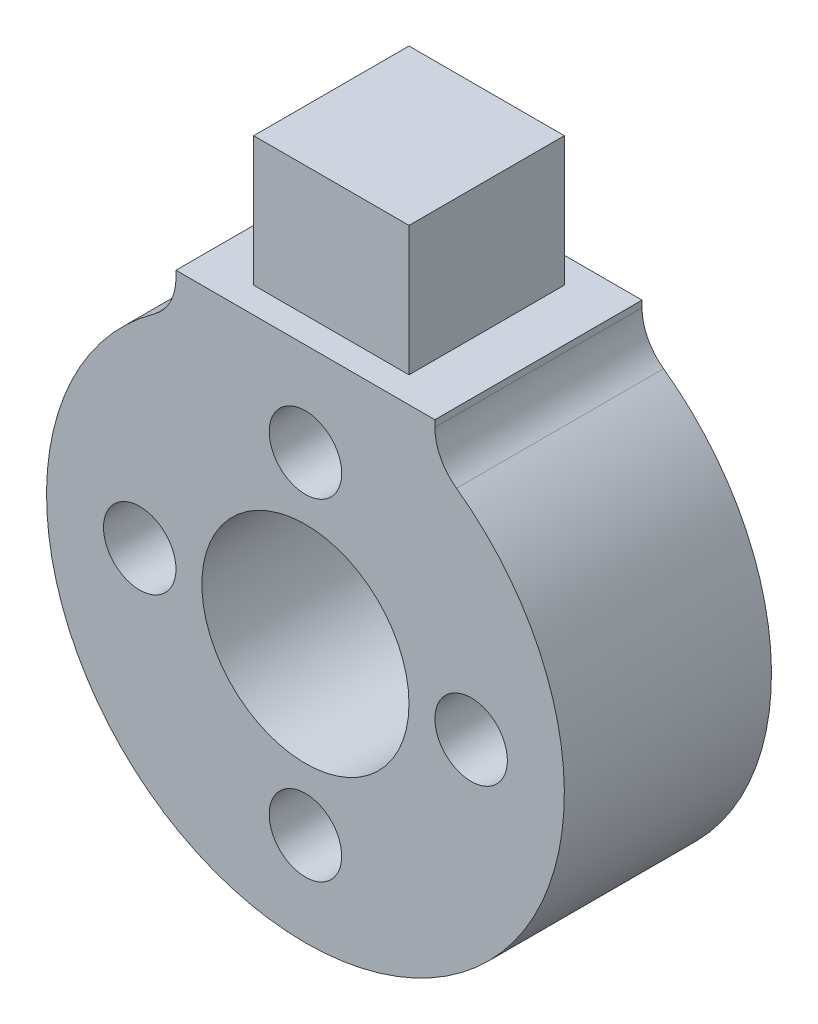
ISO-10303-21;
HEADER;
FILE_DESCRIPTION(('STEP AP214'),'2;1');
FILE_NAME('part.step','',(''),(''),'','','');
FILE_SCHEMA(('AUTOMOTIVE_DESIGN { 1 0 10303 214 1 1 1 1 }'));
ENDSEC;
DATA;
#1=APPLICATION_CONTEXT('core data for automotive mechanical design processes');
#2=APPLICATION_PROTOCOL_DEFINITION('international standard','automotive_design',2000,#1);
#3=PRODUCT_CONTEXT('',#1,'mechanical');
#4=PRODUCT('Part','Part','',(#3));
#5=PRODUCT_RELATED_PRODUCT_CATEGORY('part','',(#4));
#6=PRODUCT_DEFINITION_FORMATION('','',#4);
#7=PRODUCT_DEFINITION_CONTEXT('part definition',#1,'design');
#8=PRODUCT_DEFINITION('design','',#6,#7);
#9=PRODUCT_DEFINITION_SHAPE('','',#8);
#10=(LENGTH_UNIT() NAMED_UNIT(*) SI_UNIT(.MILLI.,.METRE.));
#11=(NAMED_UNIT(*) PLANE_ANGLE_UNIT() SI_UNIT($,.RADIAN.));
#12=(NAMED_UNIT(*) SI_UNIT($,.STERADIAN.) SOLID_ANGLE_UNIT());
#13=UNCERTAINTY_MEASURE_WITH_UNIT(LENGTH_MEASURE(1.E-05),#10,'distance_accuracy_value','');
#14=(GEOMETRIC_REPRESENTATION_CONTEXT(3) GLOBAL_UNCERTAINTY_ASSIGNED_CONTEXT((#13)) GLOBAL_UNIT_ASSIGNED_CONTEXT((#10,
#11,#12)) REPRESENTATION_CONTEXT('',''));
#15=CARTESIAN_POINT('',(0.,0.,0.));
#16=DIRECTION('',(0.,0.,1.));
#17=DIRECTION('',(1.,0.,0.));
#18=AXIS2_PLACEMENT_3D('',#15,#16,#17);
#19=CARTESIAN_POINT('',(0.,0.,10.16));
#20=DIRECTION('',(0.,0.,1.));
#21=DIRECTION('',(1.,0.,0.));
#22=AXIS2_PLACEMENT_3D('',#19,#20,#21);
#23=PLANE('',#22);
#24=CARTESIAN_POINT('',(8.128,0.,10.16));
#25=DIRECTION('',(0.,0.,1.));
#26=DIRECTION('',(1.,0.,0.));
#27=AXIS2_PLACEMENT_3D('',#24,#25,#26);
#28=CIRCLE('',#27,1.778);
#29=CARTESIAN_POINT('',(9.906,0.,10.16));
#30=VERTEX_POINT('',#29);
#31=EDGE_CURVE('E235',#30,#30,#28,.T.);
#32=ORIENTED_EDGE('',*,*,#31,.F.);
#33=EDGE_LOOP('',(#32));
#34=FACE_BOUND('',#33,.T.);
#35=CARTESIAN_POINT('',(1.61409540099723E-12,-8.128,10.16));
#36=DIRECTION('',(0.,0.,1.));
#37=DIRECTION('',(1.,0.,0.));
#38=AXIS2_PLACEMENT_3D('',#35,#36,#37);
#39=CIRCLE('',#38,1.7780000000016);
#40=CARTESIAN_POINT('',(1.77800000000321,-8.128,10.16));
#41=VERTEX_POINT('',#40);
#42=EDGE_CURVE('E251',#41,#41,#39,.T.);
#43=ORIENTED_EDGE('',*,*,#42,.F.);
#44=EDGE_LOOP('',(#43));
#45=FACE_BOUND('',#44,.T.);
#46=DIRECTION('',(1.,0.,0.));
#47=VECTOR('',#46,1.);
#48=CARTESIAN_POINT('',(-6.35,12.7,10.16));
#49=LINE('',#48,#47);
#50=CARTESIAN_POINT('',(-6.35,12.7,10.16));
#51=VERTEX_POINT('',#50);
#52=CARTESIAN_POINT('',(6.35,12.7,10.16));
#53=VERTEX_POINT('',#52);
#54=EDGE_CURVE('E267',#51,#53,#49,.T.);
#55=ORIENTED_EDGE('',*,*,#54,.F.);
#56=DIRECTION('',(0.,-1.,0.));
#57=VECTOR('',#56,1.);
#58=CARTESIAN_POINT('',(-6.35,12.7,10.16));
#59=LINE('',#58,#57);
#60=CARTESIAN_POINT('',(-6.35,12.3784288179074,10.16));
#61=VERTEX_POINT('',#60);
#62=EDGE_CURVE('E280',#51,#61,#59,.T.);
#63=ORIENTED_EDGE('',*,*,#62,.T.);
#64=CARTESIAN_POINT('',(-8.89,12.3784288179074,10.16));
#65=DIRECTION('',(0.,0.,1.));
#66=DIRECTION('',(1.,0.,0.));
#67=AXIS2_PLACEMENT_3D('',#64,#65,#66);
#68=CIRCLE('',#67,2.54);
#69=CARTESIAN_POINT('',(-7.40833333333333,10.3153573482562,10.16));
#70=VERTEX_POINT('',#69);
#71=EDGE_CURVE('E12',#61,#70,#68,.F.);
#72=ORIENTED_EDGE('',*,*,#71,.T.);
#73=CARTESIAN_POINT('',(0.,0.,10.16));
#74=DIRECTION('',(0.,0.,1.));
#75=DIRECTION('',(1.,0.,0.));
#76=AXIS2_PLACEMENT_3D('',#73,#74,#75);
#77=CIRCLE('',#76,12.7);
#78=CARTESIAN_POINT('',(7.40833333333333,10.3153573482562,10.16));
#79=VERTEX_POINT('',#78);
#80=EDGE_CURVE('E276',#70,#79,#77,.T.);
#81=ORIENTED_EDGE('',*,*,#80,.T.);
#82=CARTESIAN_POINT('',(8.89,12.3784288179074,10.16));
#83=DIRECTION('',(0.,0.,1.));
#84=DIRECTION('',(1.,0.,0.));
#85=AXIS2_PLACEMENT_3D('',#82,#83,#84);
#86=CIRCLE('',#85,2.54);
#87=CARTESIAN_POINT('',(6.35,12.3784288179074,10.16));
#88=VERTEX_POINT('',#87);
#89=EDGE_CURVE('E321',#79,#88,#86,.F.);
#90=ORIENTED_EDGE('',*,*,#89,.T.);
#91=DIRECTION('',(0.,-1.,0.));
#92=VECTOR('',#91,1.);
#93=CARTESIAN_POINT('',(6.35,12.7,10.16));
#94=LINE('',#93,#92);
#95=EDGE_CURVE('E271',#53,#88,#94,.T.);
#96=ORIENTED_EDGE('',*,*,#95,.F.);
#97=EDGE_LOOP('',(#55,#63,#72,#81,#90,#96));
#98=FACE_BOUND('',#97,.T.);
#99=CARTESIAN_POINT('',(0.,0.,10.16));
#100=DIRECTION('',(0.,0.,1.));
#101=DIRECTION('',(1.,0.,0.));
#102=AXIS2_PLACEMENT_3D('',#99,#100,#101);
#103=CIRCLE('',#102,5.08);
#104=CARTESIAN_POINT('',(5.08,0.,10.16));
#105=VERTEX_POINT('',#104);
#106=EDGE_CURVE('E259',#105,#105,#103,.T.);
#107=ORIENTED_EDGE('',*,*,#106,.F.);
#108=EDGE_LOOP('',(#107));
#109=FACE_BOUND('',#108,.T.);
#110=CARTESIAN_POINT('',(-8.128,0.,10.16));
#111=DIRECTION('',(0.,0.,1.));
#112=DIRECTION('',(1.,0.,0.));
#113=AXIS2_PLACEMENT_3D('',#110,#111,#112);
#114=CIRCLE('',#113,1.778);
#115=CARTESIAN_POINT('',(-6.35,0.,10.16));
#116=VERTEX_POINT('',#115);
#117=EDGE_CURVE('E243',#116,#116,#114,.T.);
#118=ORIENTED_EDGE('',*,*,#117,.F.);
#119=EDGE_LOOP('',(#118));
#120=FACE_BOUND('',#119,.T.);
#121=CARTESIAN_POINT('',(0.,8.128,10.16));
#122=DIRECTION('',(0.,0.,1.));
#123=DIRECTION('',(1.,0.,0.));
#124=AXIS2_PLACEMENT_3D('',#121,#122,#123);
#125=CIRCLE('',#124,1.778);
#126=CARTESIAN_POINT('',(1.778,8.128,10.16));
#127=VERTEX_POINT('',#126);
#128=EDGE_CURVE('E225',#127,#127,#125,.T.);
#129=ORIENTED_EDGE('',*,*,#128,.F.);
#130=EDGE_LOOP('',(#129));
#131=FACE_BOUND('',#130,.T.);
#132=ADVANCED_FACE('F120',(#34,#45,#98,#109,#120,#131),#23,.T.);
#133=CARTESIAN_POINT('',(0.,0.,0.));
#134=DIRECTION('',(0.,0.,1.));
#135=DIRECTION('',(1.,0.,0.));
#136=AXIS2_PLACEMENT_3D('',#133,#134,#135);
#137=PLANE('',#136);
#138=DIRECTION('',(1.,0.,0.));
#139=VECTOR('',#138,1.);
#140=CARTESIAN_POINT('',(-6.35,12.7,0.));
#141=LINE('',#140,#139);
#142=CARTESIAN_POINT('',(-6.35,12.7,0.));
#143=VERTEX_POINT('',#142);
#144=CARTESIAN_POINT('',(6.35,12.7,0.));
#145=VERTEX_POINT('',#144);
#146=EDGE_CURVE('E263',#143,#145,#141,.T.);
#147=ORIENTED_EDGE('',*,*,#146,.T.);
#148=DIRECTION('',(0.,-1.,0.));
#149=VECTOR('',#148,1.);
#150=CARTESIAN_POINT('',(6.35,12.7,0.));
#151=LINE('',#150,#149);
#152=CARTESIAN_POINT('',(6.35,12.3784288179074,0.));
#153=VERTEX_POINT('',#152);
#154=EDGE_CURVE('E288',#145,#153,#151,.T.);
#155=ORIENTED_EDGE('',*,*,#154,.T.);
#156=CARTESIAN_POINT('',(8.89,12.3784288179074,0.));
#157=DIRECTION('',(0.,0.,1.));
#158=DIRECTION('',(1.,0.,0.));
#159=AXIS2_PLACEMENT_3D('',#156,#157,#158);
#160=CIRCLE('',#159,2.54);
#161=CARTESIAN_POINT('',(7.40833333333333,10.3153573482562,0.));
#162=VERTEX_POINT('',#161);
#163=EDGE_CURVE('E318',#153,#162,#160,.T.);
#164=ORIENTED_EDGE('',*,*,#163,.T.);
#165=CARTESIAN_POINT('',(0.,0.,0.));
#166=DIRECTION('',(0.,0.,1.));
#167=DIRECTION('',(1.,0.,0.));
#168=AXIS2_PLACEMENT_3D('',#165,#166,#167);
#169=CIRCLE('',#168,12.7);
#170=CARTESIAN_POINT('',(-7.40833333333333,10.3153573482562,0.));
#171=VERTEX_POINT('',#170);
#172=EDGE_CURVE('E292',#171,#162,#169,.T.);
#173=ORIENTED_EDGE('',*,*,#172,.F.);
#174=CARTESIAN_POINT('',(-8.89,12.3784288179074,0.));
#175=DIRECTION('',(0.,0.,1.));
#176=DIRECTION('',(1.,0.,0.));
#177=AXIS2_PLACEMENT_3D('',#174,#175,#176);
#178=CIRCLE('',#177,2.54);
#179=CARTESIAN_POINT('',(-6.35,12.3784288179074,0.));
#180=VERTEX_POINT('',#179);
#181=EDGE_CURVE('E129',#171,#180,#178,.T.);
#182=ORIENTED_EDGE('',*,*,#181,.T.);
#183=DIRECTION('',(0.,-1.,0.));
#184=VECTOR('',#183,1.);
#185=CARTESIAN_POINT('',(-6.35,12.7,0.));
#186=LINE('',#185,#184);
#187=EDGE_CURVE('E272',#143,#180,#186,.T.);
#188=ORIENTED_EDGE('',*,*,#187,.F.);
#189=EDGE_LOOP('',(#147,#155,#164,#173,#182,#188));
#190=FACE_BOUND('',#189,.T.);
#191=CARTESIAN_POINT('',(0.,0.,0.));
#192=DIRECTION('',(0.,0.,1.));
#193=DIRECTION('',(1.,0.,0.));
#194=AXIS2_PLACEMENT_3D('',#191,#192,#193);
#195=CIRCLE('',#194,5.08);
#196=CARTESIAN_POINT('',(5.08,0.,0.));
#197=VERTEX_POINT('',#196);
#198=EDGE_CURVE('E255',#197,#197,#195,.T.);
#199=ORIENTED_EDGE('',*,*,#198,.T.);
#200=EDGE_LOOP('',(#199));
#201=FACE_BOUND('',#200,.T.);
#202=CARTESIAN_POINT('',(1.61409540099723E-12,-8.128,0.));
#203=DIRECTION('',(0.,0.,1.));
#204=DIRECTION('',(1.,0.,0.));
#205=AXIS2_PLACEMENT_3D('',#202,#203,#204);
#206=CIRCLE('',#205,1.7780000000016);
#207=CARTESIAN_POINT('',(1.77800000000321,-8.128,0.));
#208=VERTEX_POINT('',#207);
#209=EDGE_CURVE('E247',#208,#208,#206,.T.);
#210=ORIENTED_EDGE('',*,*,#209,.T.);
#211=EDGE_LOOP('',(#210));
#212=FACE_BOUND('',#211,.T.);
#213=CARTESIAN_POINT('',(-8.128,0.,0.));
#214=DIRECTION('',(0.,0.,1.));
#215=DIRECTION('',(1.,0.,0.));
#216=AXIS2_PLACEMENT_3D('',#213,#214,#215);
#217=CIRCLE('',#216,1.778);
#218=CARTESIAN_POINT('',(-6.35,0.,0.));
#219=VERTEX_POINT('',#218);
#220=EDGE_CURVE('E239',#219,#219,#217,.T.);
#221=ORIENTED_EDGE('',*,*,#220,.T.);
#222=EDGE_LOOP('',(#221));
#223=FACE_BOUND('',#222,.T.);
#224=CARTESIAN_POINT('',(8.128,0.,0.));
#225=DIRECTION('',(0.,0.,1.));
#226=DIRECTION('',(1.,0.,0.));
#227=AXIS2_PLACEMENT_3D('',#224,#225,#226);
#228=CIRCLE('',#227,1.778);
#229=CARTESIAN_POINT('',(9.906,0.,0.));
#230=VERTEX_POINT('',#229);
#231=EDGE_CURVE('E233',#230,#230,#228,.T.);
#232=ORIENTED_EDGE('',*,*,#231,.T.);
#233=EDGE_LOOP('',(#232));
#234=FACE_BOUND('',#233,.T.);
#235=CARTESIAN_POINT('',(0.,8.128,0.));
#236=DIRECTION('',(0.,0.,1.));
#237=DIRECTION('',(1.,0.,0.));
#238=AXIS2_PLACEMENT_3D('',#235,#236,#237);
#239=CIRCLE('',#238,1.778);
#240=CARTESIAN_POINT('',(1.778,8.128,0.));
#241=VERTEX_POINT('',#240);
#242=EDGE_CURVE('E220',#241,#241,#239,.T.);
#243=ORIENTED_EDGE('',*,*,#242,.T.);
#244=EDGE_LOOP('',(#243));
#245=FACE_BOUND('',#244,.T.);
#246=ADVANCED_FACE('F327',(#190,#201,#212,#223,#234,#245),#137,.F.);
#247=CARTESIAN_POINT('',(-6.35,12.7,10.16));
#248=DIRECTION('',(0.,1.,0.));
#249=DIRECTION('',(0.,0.,1.));
#250=AXIS2_PLACEMENT_3D('',#247,#248,#249);
#251=PLANE('',#250);
#252=DIRECTION('',(0.,0.,-1.));
#253=VECTOR('',#252,1.);
#254=CARTESIAN_POINT('',(3.81,12.7,8.89));
#255=LINE('',#254,#253);
#256=CARTESIAN_POINT('',(3.81,12.7,8.89));
#257=VERTEX_POINT('',#256);
#258=CARTESIAN_POINT('',(3.81,12.7,1.27));
#259=VERTEX_POINT('',#258);
#260=EDGE_CURVE('E136',#257,#259,#255,.T.);
#261=ORIENTED_EDGE('',*,*,#260,.F.);
#262=DIRECTION('',(1.,0.,0.));
#263=VECTOR('',#262,1.);
#264=CARTESIAN_POINT('',(-3.81,12.7,8.89));
#265=LINE('',#264,#263);
#266=CARTESIAN_POINT('',(-3.81,12.7,8.89));
#267=VERTEX_POINT('',#266);
#268=EDGE_CURVE('E140',#267,#257,#265,.T.);
#269=ORIENTED_EDGE('',*,*,#268,.F.);
#270=DIRECTION('',(0.,0.,1.));
#271=VECTOR('',#270,1.);
#272=CARTESIAN_POINT('',(-3.81,12.7,8.89));
#273=LINE('',#272,#271);
#274=CARTESIAN_POINT('',(-3.81,12.7,1.27));
#275=VERTEX_POINT('',#274);
#276=EDGE_CURVE('E570',#275,#267,#273,.T.);
#277=ORIENTED_EDGE('',*,*,#276,.F.);
#278=DIRECTION('',(-1.,0.,0.));
#279=VECTOR('',#278,1.);
#280=CARTESIAN_POINT('',(-3.81,12.7,1.27));
#281=LINE('',#280,#279);
#282=EDGE_CURVE('E580',#259,#275,#281,.T.);
#283=ORIENTED_EDGE('',*,*,#282,.F.);
#284=EDGE_LOOP('',(#261,#269,#277,#283));
#285=FACE_BOUND('',#284,.T.);
#286=ORIENTED_EDGE('',*,*,#146,.F.);
#287=DIRECTION('',(0.,0.,-1.));
#288=VECTOR('',#287,1.);
#289=CARTESIAN_POINT('',(-6.35,12.7,10.16));
#290=LINE('',#289,#288);
#291=EDGE_CURVE('E299',#51,#143,#290,.T.);
#292=ORIENTED_EDGE('',*,*,#291,.F.);
#293=ORIENTED_EDGE('',*,*,#54,.T.);
#294=DIRECTION('',(0.,0.,-1.));
#295=VECTOR('',#294,1.);
#296=CARTESIAN_POINT('',(6.35,12.7,10.16));
#297=LINE('',#296,#295);
#298=EDGE_CURVE('E284',#53,#145,#297,.T.);
#299=ORIENTED_EDGE('',*,*,#298,.T.);
#300=EDGE_LOOP('',(#286,#292,#293,#299));
#301=FACE_BOUND('',#300,.T.);
#302=ADVANCED_FACE('F353',(#285,#301),#251,.T.);
#303=CARTESIAN_POINT('',(-6.35,12.7,10.16));
#304=DIRECTION('',(1.,0.,0.));
#305=DIRECTION('',(0.,0.,-1.));
#306=AXIS2_PLACEMENT_3D('',#303,#304,#305);
#307=PLANE('',#306);
#308=ORIENTED_EDGE('',*,*,#187,.T.);
#309=DIRECTION('',(0.,0.,1.));
#310=VECTOR('',#309,1.);
#311=CARTESIAN_POINT('',(-6.35,12.3784288179074,10.16));
#312=LINE('',#311,#310);
#313=EDGE_CURVE('E315',#180,#61,#312,.T.);
#314=ORIENTED_EDGE('',*,*,#313,.T.);
#315=ORIENTED_EDGE('',*,*,#62,.F.);
#316=ORIENTED_EDGE('',*,*,#291,.T.);
#317=EDGE_LOOP('',(#308,#314,#315,#316));
#318=FACE_BOUND('',#317,.T.);
#319=ADVANCED_FACE('F334',(#318),#307,.F.);
#320=CARTESIAN_POINT('',(0.,0.,10.16));
#321=DIRECTION('',(0.,0.,-1.));
#322=DIRECTION('',(-1.,0.,0.));
#323=AXIS2_PLACEMENT_3D('',#320,#321,#322);
#324=CYLINDRICAL_SURFACE('',#323,12.7);
#325=ORIENTED_EDGE('',*,*,#172,.T.);
#326=DIRECTION('',(0.,0.,-1.));
#327=VECTOR('',#326,1.);
#328=CARTESIAN_POINT('',(7.40833333333333,10.3153573482562,10.16));
#329=LINE('',#328,#327);
#330=EDGE_CURVE('E312',#162,#79,#329,.F.);
#331=ORIENTED_EDGE('',*,*,#330,.T.);
#332=ORIENTED_EDGE('',*,*,#80,.F.);
#333=DIRECTION('',(0.,0.,-1.));
#334=VECTOR('',#333,1.);
#335=CARTESIAN_POINT('',(-7.40833333333333,10.3153573482562,10.16));
#336=LINE('',#335,#334);
#337=EDGE_CURVE('E308',#70,#171,#336,.T.);
#338=ORIENTED_EDGE('',*,*,#337,.T.);
#339=EDGE_LOOP('',(#325,#331,#332,#338));
#340=FACE_BOUND('',#339,.T.);
#341=ADVANCED_FACE('F343',(#340),#324,.T.);
#342=CARTESIAN_POINT('',(6.35,12.7,10.16));
#343=DIRECTION('',(1.,0.,0.));
#344=DIRECTION('',(0.,0.,-1.));
#345=AXIS2_PLACEMENT_3D('',#342,#343,#344);
#346=PLANE('',#345);
#347=ORIENTED_EDGE('',*,*,#95,.T.);
#348=DIRECTION('',(0.,0.,-1.));
#349=VECTOR('',#348,1.);
#350=CARTESIAN_POINT('',(6.35,12.3784288179074,10.16));
#351=LINE('',#350,#349);
#352=EDGE_CURVE('E302',#88,#153,#351,.T.);
#353=ORIENTED_EDGE('',*,*,#352,.T.);
#354=ORIENTED_EDGE('',*,*,#154,.F.);
#355=ORIENTED_EDGE('',*,*,#298,.F.);
#356=EDGE_LOOP('',(#347,#353,#354,#355));
#357=FACE_BOUND('',#356,.T.);
#358=ADVANCED_FACE('F350',(#357),#346,.T.);
#359=CARTESIAN_POINT('',(0.,0.,10.16));
#360=DIRECTION('',(0.,0.,-1.));
#361=DIRECTION('',(-1.,0.,0.));
#362=AXIS2_PLACEMENT_3D('',#359,#360,#361);
#363=CYLINDRICAL_SURFACE('',#362,5.08);
#364=ORIENTED_EDGE('',*,*,#106,.T.);
#365=EDGE_LOOP('',(#364));
#366=FACE_BOUND('',#365,.T.);
#367=ORIENTED_EDGE('',*,*,#198,.F.);
#368=EDGE_LOOP('',(#367));
#369=FACE_BOUND('',#368,.T.);
#370=ADVANCED_FACE('F373',(#366,#369),#363,.F.);
#371=CARTESIAN_POINT('',(1.61409540099723E-12,-8.128,10.16));
#372=DIRECTION('',(0.,0.,-1.));
#373=DIRECTION('',(-1.,0.,0.));
#374=AXIS2_PLACEMENT_3D('',#371,#372,#373);
#375=CYLINDRICAL_SURFACE('',#374,1.7780000000016);
#376=ORIENTED_EDGE('',*,*,#42,.T.);
#377=EDGE_LOOP('',(#376));
#378=FACE_BOUND('',#377,.T.);
#379=ORIENTED_EDGE('',*,*,#209,.F.);
#380=EDGE_LOOP('',(#379));
#381=FACE_BOUND('',#380,.T.);
#382=ADVANCED_FACE('F381',(#378,#381),#375,.F.);
#383=CARTESIAN_POINT('',(-8.128,0.,10.16));
#384=DIRECTION('',(0.,0.,-1.));
#385=DIRECTION('',(-1.,0.,0.));
#386=AXIS2_PLACEMENT_3D('',#383,#384,#385);
#387=CYLINDRICAL_SURFACE('',#386,1.778);
#388=ORIENTED_EDGE('',*,*,#117,.T.);
#389=EDGE_LOOP('',(#388));
#390=FACE_BOUND('',#389,.T.);
#391=ORIENTED_EDGE('',*,*,#220,.F.);
#392=EDGE_LOOP('',(#391));
#393=FACE_BOUND('',#392,.T.);
#394=ADVANCED_FACE('F386',(#390,#393),#387,.F.);
#395=CARTESIAN_POINT('',(8.128,0.,10.16));
#396=DIRECTION('',(0.,0.,-1.));
#397=DIRECTION('',(-1.,0.,0.));
#398=AXIS2_PLACEMENT_3D('',#395,#396,#397);
#399=CYLINDRICAL_SURFACE('',#398,1.778);
#400=ORIENTED_EDGE('',*,*,#31,.T.);
#401=EDGE_LOOP('',(#400));
#402=FACE_BOUND('',#401,.T.);
#403=ORIENTED_EDGE('',*,*,#231,.F.);
#404=EDGE_LOOP('',(#403));
#405=FACE_BOUND('',#404,.T.);
#406=ADVANCED_FACE('F402',(#402,#405),#399,.F.);
#407=CARTESIAN_POINT('',(0.,8.128,10.16));
#408=DIRECTION('',(0.,0.,-1.));
#409=DIRECTION('',(-1.,0.,0.));
#410=AXIS2_PLACEMENT_3D('',#407,#408,#409);
#411=CYLINDRICAL_SURFACE('',#410,1.778);
#412=ORIENTED_EDGE('',*,*,#128,.T.);
#413=EDGE_LOOP('',(#412));
#414=FACE_BOUND('',#413,.T.);
#415=ORIENTED_EDGE('',*,*,#242,.F.);
#416=EDGE_LOOP('',(#415));
#417=FACE_BOUND('',#416,.T.);
#418=ADVANCED_FACE('F400',(#414,#417),#411,.F.);
#419=CARTESIAN_POINT('',(8.89,12.3784288179074,10.16));
#420=DIRECTION('',(0.,0.,-1.));
#421=DIRECTION('',(-1.,0.,0.));
#422=AXIS2_PLACEMENT_3D('',#419,#420,#421);
#423=CYLINDRICAL_SURFACE('',#422,2.54);
#424=ORIENTED_EDGE('',*,*,#89,.F.);
#425=ORIENTED_EDGE('',*,*,#330,.F.);
#426=ORIENTED_EDGE('',*,*,#163,.F.);
#427=ORIENTED_EDGE('',*,*,#352,.F.);
#428=EDGE_LOOP('',(#424,#425,#426,#427));
#429=FACE_BOUND('',#428,.T.);
#430=ADVANCED_FACE('F346',(#429),#423,.F.);
#431=CARTESIAN_POINT('',(-8.89,12.3784288179074,10.16));
#432=DIRECTION('',(0.,0.,-1.));
#433=DIRECTION('',(-1.,0.,0.));
#434=AXIS2_PLACEMENT_3D('',#431,#432,#433);
#435=CYLINDRICAL_SURFACE('',#434,2.54);
#436=ORIENTED_EDGE('',*,*,#71,.F.);
#437=ORIENTED_EDGE('',*,*,#313,.F.);
#438=ORIENTED_EDGE('',*,*,#181,.F.);
#439=ORIENTED_EDGE('',*,*,#337,.F.);
#440=EDGE_LOOP('',(#436,#437,#438,#439));
#441=FACE_BOUND('',#440,.T.);
#442=ADVANCED_FACE('F122',(#441),#435,.F.);
#443=CARTESIAN_POINT('',(3.81,19.05,8.89));
#444=DIRECTION('',(-1.,0.,0.));
#445=DIRECTION('',(0.,0.,1.));
#446=AXIS2_PLACEMENT_3D('',#443,#444,#445);
#447=PLANE('',#446);
#448=ORIENTED_EDGE('',*,*,#260,.T.);
#449=DIRECTION('',(0.,-1.,0.));
#450=VECTOR('',#449,1.);
#451=CARTESIAN_POINT('',(3.81,19.05,1.27));
#452=LINE('',#451,#450);
#453=CARTESIAN_POINT('',(3.81,19.05,1.27));
#454=VERTEX_POINT('',#453);
#455=EDGE_CURVE('E200',#454,#259,#452,.T.);
#456=ORIENTED_EDGE('',*,*,#455,.F.);
#457=DIRECTION('',(0.,0.,-1.));
#458=VECTOR('',#457,1.);
#459=CARTESIAN_POINT('',(3.81,19.05,8.89));
#460=LINE('',#459,#458);
#461=CARTESIAN_POINT('',(3.81,19.05,8.89));
#462=VERTEX_POINT('',#461);
#463=EDGE_CURVE('E207',#462,#454,#460,.T.);
#464=ORIENTED_EDGE('',*,*,#463,.F.);
#465=DIRECTION('',(0.,-1.,0.));
#466=VECTOR('',#465,1.);
#467=CARTESIAN_POINT('',(3.81,19.05,8.89));
#468=LINE('',#467,#466);
#469=EDGE_CURVE('E567',#462,#257,#468,.T.);
#470=ORIENTED_EDGE('',*,*,#469,.T.);
#471=EDGE_LOOP('',(#448,#456,#464,#470));
#472=FACE_BOUND('',#471,.T.);
#473=ADVANCED_FACE('F218',(#472),#447,.F.);
#474=CARTESIAN_POINT('',(-3.81,19.05,1.27));
#475=DIRECTION('',(0.,0.,1.));
#476=DIRECTION('',(1.,0.,0.));
#477=AXIS2_PLACEMENT_3D('',#474,#475,#476);
#478=PLANE('',#477);
#479=ORIENTED_EDGE('',*,*,#282,.T.);
#480=DIRECTION('',(0.,-1.,0.));
#481=VECTOR('',#480,1.);
#482=CARTESIAN_POINT('',(-3.81,19.05,1.27));
#483=LINE('',#482,#481);
#484=CARTESIAN_POINT('',(-3.81,19.05,1.27));
#485=VERTEX_POINT('',#484);
#486=EDGE_CURVE('E202',#485,#275,#483,.T.);
#487=ORIENTED_EDGE('',*,*,#486,.F.);
#488=DIRECTION('',(-1.,0.,0.));
#489=VECTOR('',#488,1.);
#490=CARTESIAN_POINT('',(-3.81,19.05,1.27));
#491=LINE('',#490,#489);
#492=EDGE_CURVE('E195',#454,#485,#491,.T.);
#493=ORIENTED_EDGE('',*,*,#492,.F.);
#494=ORIENTED_EDGE('',*,*,#455,.T.);
#495=EDGE_LOOP('',(#479,#487,#493,#494));
#496=FACE_BOUND('',#495,.T.);
#497=ADVANCED_FACE('F198',(#496),#478,.F.);
#498=CARTESIAN_POINT('',(-3.81,19.05,8.89));
#499=DIRECTION('',(1.,0.,0.));
#500=DIRECTION('',(0.,0.,-1.));
#501=AXIS2_PLACEMENT_3D('',#498,#499,#500);
#502=PLANE('',#501);
#503=ORIENTED_EDGE('',*,*,#276,.T.);
#504=DIRECTION('',(0.,-1.,0.));
#505=VECTOR('',#504,1.);
#506=CARTESIAN_POINT('',(-3.81,19.05,8.89));
#507=LINE('',#506,#505);
#508=CARTESIAN_POINT('',(-3.81,19.05,8.89));
#509=VERTEX_POINT('',#508);
#510=EDGE_CURVE('E227',#509,#267,#507,.T.);
#511=ORIENTED_EDGE('',*,*,#510,.F.);
#512=DIRECTION('',(0.,0.,1.));
#513=VECTOR('',#512,1.);
#514=CARTESIAN_POINT('',(-3.81,19.05,8.89));
#515=LINE('',#514,#513);
#516=EDGE_CURVE('E206',#485,#509,#515,.T.);
#517=ORIENTED_EDGE('',*,*,#516,.F.);
#518=ORIENTED_EDGE('',*,*,#486,.T.);
#519=EDGE_LOOP('',(#503,#511,#517,#518));
#520=FACE_BOUND('',#519,.T.);
#521=ADVANCED_FACE('F494',(#520),#502,.F.);
#522=CARTESIAN_POINT('',(-3.81,19.05,8.89));
#523=DIRECTION('',(0.,0.,-1.));
#524=DIRECTION('',(-1.,0.,0.));
#525=AXIS2_PLACEMENT_3D('',#522,#523,#524);
#526=PLANE('',#525);
#527=ORIENTED_EDGE('',*,*,#268,.T.);
#528=ORIENTED_EDGE('',*,*,#469,.F.);
#529=DIRECTION('',(1.,0.,0.));
#530=VECTOR('',#529,1.);
#531=CARTESIAN_POINT('',(-3.81,19.05,8.89));
#532=LINE('',#531,#530);
#533=EDGE_CURVE('E212',#509,#462,#532,.T.);
#534=ORIENTED_EDGE('',*,*,#533,.F.);
#535=ORIENTED_EDGE('',*,*,#510,.T.);
#536=EDGE_LOOP('',(#527,#528,#534,#535));
#537=FACE_BOUND('',#536,.T.);
#538=ADVANCED_FACE('F500',(#537),#526,.F.);
#539=CARTESIAN_POINT('',(0.,19.05,0.));
#540=DIRECTION('',(0.,-1.,0.));
#541=DIRECTION('',(0.,0.,-1.));
#542=AXIS2_PLACEMENT_3D('',#539,#540,#541);
#543=PLANE('',#542);
#544=ORIENTED_EDGE('',*,*,#463,.T.);
#545=ORIENTED_EDGE('',*,*,#492,.T.);
#546=ORIENTED_EDGE('',*,*,#516,.T.);
#547=ORIENTED_EDGE('',*,*,#533,.T.);
#548=EDGE_LOOP('',(#544,#545,#546,#547));
#549=FACE_BOUND('',#548,.T.);
#550=ADVANCED_FACE('F210',(#549),#543,.F.);
#551=CLOSED_SHELL('',(#132,#246,#302,#319,#341,#358,#370,#382,#394,#406,#418,#430,#442,#473,
#497,#521,#538,#550));
#552=MANIFOLD_SOLID_BREP('B2',#551);
#553=ADVANCED_BREP_SHAPE_REPRESENTATION('',(#18,#552),#14);
#554=SHAPE_DEFINITION_REPRESENTATION(#9,#553);
ENDSEC;
END-ISO-10303-21;
